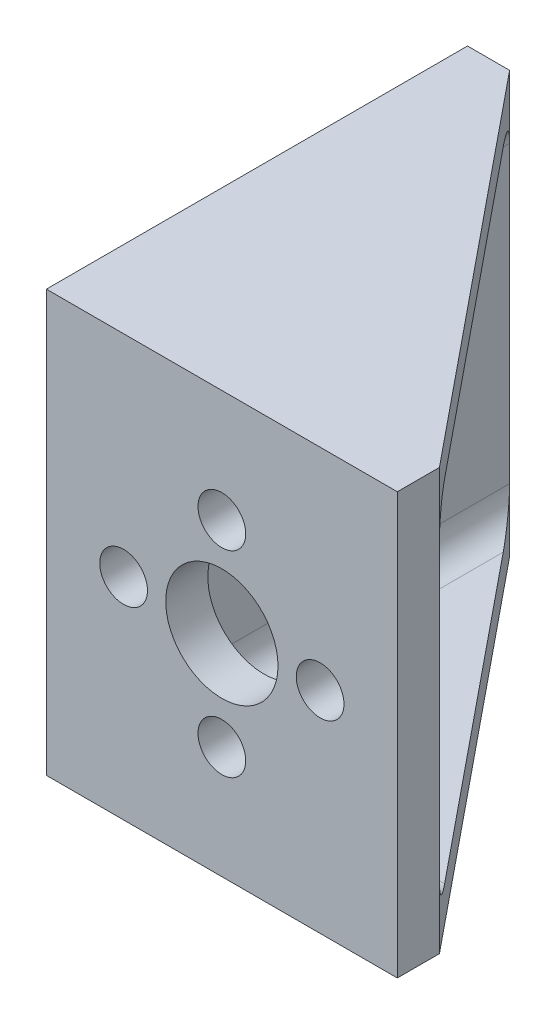
ISO-10303-21;
HEADER;
FILE_DESCRIPTION(('STEP AP214'),'2;1');
FILE_NAME('part.step','',(''),(''),'','','');
FILE_SCHEMA(('AUTOMOTIVE_DESIGN { 1 0 10303 214 1 1 1 1 }'));
ENDSEC;
DATA;
#1=APPLICATION_CONTEXT('core data for automotive mechanical design processes');
#2=APPLICATION_PROTOCOL_DEFINITION('international standard','automotive_design',2000,#1);
#3=PRODUCT_CONTEXT('',#1,'mechanical');
#4=PRODUCT('Part','Part','',(#3));
#5=PRODUCT_RELATED_PRODUCT_CATEGORY('part','',(#4));
#6=PRODUCT_DEFINITION_FORMATION('','',#4);
#7=PRODUCT_DEFINITION_CONTEXT('part definition',#1,'design');
#8=PRODUCT_DEFINITION('design','',#6,#7);
#9=PRODUCT_DEFINITION_SHAPE('','',#8);
#10=(LENGTH_UNIT() NAMED_UNIT(*) SI_UNIT(.MILLI.,.METRE.));
#11=(NAMED_UNIT(*) PLANE_ANGLE_UNIT() SI_UNIT($,.RADIAN.));
#12=(NAMED_UNIT(*) SI_UNIT($,.STERADIAN.) SOLID_ANGLE_UNIT());
#13=UNCERTAINTY_MEASURE_WITH_UNIT(LENGTH_MEASURE(1.E-05),#10,'distance_accuracy_value','');
#14=(GEOMETRIC_REPRESENTATION_CONTEXT(3) GLOBAL_UNCERTAINTY_ASSIGNED_CONTEXT((#13)) GLOBAL_UNIT_ASSIGNED_CONTEXT((#10,
#11,#12)) REPRESENTATION_CONTEXT('',''));
#15=CARTESIAN_POINT('',(0.,0.,0.));
#16=DIRECTION('',(0.,0.,1.));
#17=DIRECTION('',(1.,0.,0.));
#18=AXIS2_PLACEMENT_3D('',#15,#16,#17);
#19=CARTESIAN_POINT('',(3.,30.,-3.));
#20=DIRECTION('',(0.,0.,1.));
#21=DIRECTION('',(1.,0.,0.));
#22=AXIS2_PLACEMENT_3D('',#19,#20,#21);
#23=PLANE('',#22);
#24=CARTESIAN_POINT('',(12.5,22.,-3.));
#25=DIRECTION('',(0.,0.,1.));
#26=DIRECTION('',(1.,0.,0.));
#27=AXIS2_PLACEMENT_3D('',#24,#25,#26);
#28=CIRCLE('',#27,1.7);
#29=CARTESIAN_POINT('',(14.2,22.,-3.));
#30=VERTEX_POINT('',#29);
#31=EDGE_CURVE('E200',#30,#30,#28,.T.);
#32=ORIENTED_EDGE('',*,*,#31,.T.);
#33=EDGE_LOOP('',(#32));
#34=FACE_BOUND('',#33,.T.);
#35=CARTESIAN_POINT('',(19.5,15.,-3.));
#36=DIRECTION('',(0.,0.,1.));
#37=DIRECTION('',(1.,0.,0.));
#38=AXIS2_PLACEMENT_3D('',#35,#36,#37);
#39=CIRCLE('',#38,1.7);
#40=CARTESIAN_POINT('',(21.2,15.,-3.));
#41=VERTEX_POINT('',#40);
#42=EDGE_CURVE('E197',#41,#41,#39,.T.);
#43=ORIENTED_EDGE('',*,*,#42,.T.);
#44=EDGE_LOOP('',(#43));
#45=FACE_BOUND('',#44,.T.);
#46=CARTESIAN_POINT('',(12.5,8.,-3.));
#47=DIRECTION('',(0.,0.,1.));
#48=DIRECTION('',(1.,0.,0.));
#49=AXIS2_PLACEMENT_3D('',#46,#47,#48);
#50=CIRCLE('',#49,1.7);
#51=CARTESIAN_POINT('',(14.2,8.,-3.));
#52=VERTEX_POINT('',#51);
#53=EDGE_CURVE('E194',#52,#52,#50,.T.);
#54=ORIENTED_EDGE('',*,*,#53,.T.);
#55=EDGE_LOOP('',(#54));
#56=FACE_BOUND('',#55,.T.);
#57=CARTESIAN_POINT('',(5.5,15.,-3.));
#58=DIRECTION('',(0.,0.,1.));
#59=DIRECTION('',(1.,0.,0.));
#60=AXIS2_PLACEMENT_3D('',#57,#58,#59);
#61=CIRCLE('',#60,1.7);
#62=CARTESIAN_POINT('',(7.2,15.,-3.));
#63=VERTEX_POINT('',#62);
#64=EDGE_CURVE('E191',#63,#63,#61,.T.);
#65=ORIENTED_EDGE('',*,*,#64,.T.);
#66=EDGE_LOOP('',(#65));
#67=FACE_BOUND('',#66,.T.);
#68=CARTESIAN_POINT('',(12.5,15.,-3.));
#69=DIRECTION('',(0.,0.,1.));
#70=DIRECTION('',(1.,0.,0.));
#71=AXIS2_PLACEMENT_3D('',#68,#69,#70);
#72=CIRCLE('',#71,4.);
#73=CARTESIAN_POINT('',(16.5,15.,-3.));
#74=VERTEX_POINT('',#73);
#75=EDGE_CURVE('E188',#74,#74,#72,.T.);
#76=ORIENTED_EDGE('',*,*,#75,.T.);
#77=EDGE_LOOP('',(#76));
#78=FACE_BOUND('',#77,.T.);
#79=DIRECTION('',(1.,0.,0.));
#80=VECTOR('',#79,1.);
#81=CARTESIAN_POINT('',(3.,4.5,-3.));
#82=LINE('',#81,#80);
#83=CARTESIAN_POINT('',(25.,4.5,-3.));
#84=VERTEX_POINT('',#83);
#85=CARTESIAN_POINT('',(3.6,4.5,-3.));
#86=VERTEX_POINT('',#85);
#87=EDGE_CURVE('E505',#84,#86,#82,.F.);
#88=ORIENTED_EDGE('',*,*,#87,.T.);
#89=DIRECTION('',(0.,1.,0.));
#90=VECTOR('',#89,1.);
#91=CARTESIAN_POINT('',(3.6,25.5,-3.));
#92=LINE('',#91,#90);
#93=CARTESIAN_POINT('',(3.6,25.5,-3.));
#94=VERTEX_POINT('',#93);
#95=EDGE_CURVE('E52',#86,#94,#92,.T.);
#96=ORIENTED_EDGE('',*,*,#95,.T.);
#97=DIRECTION('',(-1.,0.,0.));
#98=VECTOR('',#97,1.);
#99=CARTESIAN_POINT('',(25.,25.5,-3.));
#100=LINE('',#99,#98);
#101=CARTESIAN_POINT('',(25.,25.5,-3.));
#102=VERTEX_POINT('',#101);
#103=EDGE_CURVE('E321',#94,#102,#100,.F.);
#104=ORIENTED_EDGE('',*,*,#103,.T.);
#105=DIRECTION('',(0.,-1.,0.));
#106=VECTOR('',#105,1.);
#107=CARTESIAN_POINT('',(25.,30.,-3.));
#108=LINE('',#107,#106);
#109=EDGE_CURVE('E248',#102,#84,#108,.T.);
#110=ORIENTED_EDGE('',*,*,#109,.T.);
#111=EDGE_LOOP('',(#88,#96,#104,#110));
#112=FACE_BOUND('',#111,.T.);
#113=ADVANCED_FACE('F42',(#34,#45,#56,#67,#78,#112),#23,.F.);
#114=CARTESIAN_POINT('',(3.,30.,-30.));
#115=DIRECTION('',(-1.,0.,0.));
#116=DIRECTION('',(0.,0.,1.));
#117=AXIS2_PLACEMENT_3D('',#114,#115,#116);
#118=PLANE('',#117);
#119=CARTESIAN_POINT('',(3.,15.,-20.));
#120=DIRECTION('',(-1.,0.,0.));
#121=DIRECTION('',(0.,0.,1.));
#122=AXIS2_PLACEMENT_3D('',#119,#120,#121);
#123=CIRCLE('',#122,2.75);
#124=CARTESIAN_POINT('',(3.,15.,-17.25));
#125=VERTEX_POINT('',#124);
#126=EDGE_CURVE('E428',#125,#125,#123,.T.);
#127=ORIENTED_EDGE('',*,*,#126,.T.);
#128=EDGE_LOOP('',(#127));
#129=FACE_BOUND('',#128,.T.);
#130=DIRECTION('',(0.,0.,-1.));
#131=VECTOR('',#130,1.);
#132=CARTESIAN_POINT('',(3.,25.5,-3.));
#133=LINE('',#132,#131);
#134=CARTESIAN_POINT('',(3.,25.5,-30.));
#135=VERTEX_POINT('',#134);
#136=CARTESIAN_POINT('',(3.,25.5,-3.6));
#137=VERTEX_POINT('',#136);
#138=EDGE_CURVE('E264',#135,#137,#133,.F.);
#139=ORIENTED_EDGE('',*,*,#138,.T.);
#140=DIRECTION('',(0.,-1.,0.));
#141=VECTOR('',#140,1.);
#142=CARTESIAN_POINT('',(3.,4.5,-3.6));
#143=LINE('',#142,#141);
#144=CARTESIAN_POINT('',(3.,4.5,-3.6));
#145=VERTEX_POINT('',#144);
#146=EDGE_CURVE('E69',#137,#145,#143,.T.);
#147=ORIENTED_EDGE('',*,*,#146,.T.);
#148=DIRECTION('',(0.,0.,1.));
#149=VECTOR('',#148,1.);
#150=CARTESIAN_POINT('',(3.,4.5,-30.));
#151=LINE('',#150,#149);
#152=CARTESIAN_POINT('',(3.00000000000001,4.5,-30.));
#153=VERTEX_POINT('',#152);
#154=EDGE_CURVE('E267',#145,#153,#151,.F.);
#155=ORIENTED_EDGE('',*,*,#154,.T.);
#156=DIRECTION('',(0.,-1.,0.));
#157=VECTOR('',#156,1.);
#158=CARTESIAN_POINT('',(3.,30.,-30.));
#159=LINE('',#158,#157);
#160=EDGE_CURVE('E245',#135,#153,#159,.T.);
#161=ORIENTED_EDGE('',*,*,#160,.F.);
#162=EDGE_LOOP('',(#139,#147,#155,#161));
#163=FACE_BOUND('',#162,.T.);
#164=ADVANCED_FACE('F343',(#129,#163),#118,.F.);
#165=CARTESIAN_POINT('',(25.,30.,0.));
#166=DIRECTION('',(0.,0.,-1.));
#167=DIRECTION('',(-1.,0.,0.));
#168=AXIS2_PLACEMENT_3D('',#165,#166,#167);
#169=PLANE('',#168);
#170=CARTESIAN_POINT('',(12.5,22.,0.));
#171=DIRECTION('',(0.,0.,1.));
#172=DIRECTION('',(1.,0.,0.));
#173=AXIS2_PLACEMENT_3D('',#170,#171,#172);
#174=CIRCLE('',#173,1.7);
#175=CARTESIAN_POINT('',(14.2,22.,0.));
#176=VERTEX_POINT('',#175);
#177=EDGE_CURVE('E180',#176,#176,#174,.T.);
#178=ORIENTED_EDGE('',*,*,#177,.F.);
#179=EDGE_LOOP('',(#178));
#180=FACE_BOUND('',#179,.T.);
#181=CARTESIAN_POINT('',(19.5,15.,0.));
#182=DIRECTION('',(0.,0.,1.));
#183=DIRECTION('',(1.,0.,0.));
#184=AXIS2_PLACEMENT_3D('',#181,#182,#183);
#185=CIRCLE('',#184,1.7);
#186=CARTESIAN_POINT('',(21.2,15.,0.));
#187=VERTEX_POINT('',#186);
#188=EDGE_CURVE('E177',#187,#187,#185,.T.);
#189=ORIENTED_EDGE('',*,*,#188,.F.);
#190=EDGE_LOOP('',(#189));
#191=FACE_BOUND('',#190,.T.);
#192=CARTESIAN_POINT('',(12.5,8.,0.));
#193=DIRECTION('',(0.,0.,1.));
#194=DIRECTION('',(1.,0.,0.));
#195=AXIS2_PLACEMENT_3D('',#192,#193,#194);
#196=CIRCLE('',#195,1.7);
#197=CARTESIAN_POINT('',(14.2,8.,0.));
#198=VERTEX_POINT('',#197);
#199=EDGE_CURVE('E174',#198,#198,#196,.T.);
#200=ORIENTED_EDGE('',*,*,#199,.F.);
#201=EDGE_LOOP('',(#200));
#202=FACE_BOUND('',#201,.T.);
#203=CARTESIAN_POINT('',(5.5,15.,0.));
#204=DIRECTION('',(0.,0.,1.));
#205=DIRECTION('',(1.,0.,0.));
#206=AXIS2_PLACEMENT_3D('',#203,#204,#205);
#207=CIRCLE('',#206,1.7);
#208=CARTESIAN_POINT('',(7.2,15.,0.));
#209=VERTEX_POINT('',#208);
#210=EDGE_CURVE('E170',#209,#209,#207,.T.);
#211=ORIENTED_EDGE('',*,*,#210,.F.);
#212=EDGE_LOOP('',(#211));
#213=FACE_BOUND('',#212,.T.);
#214=CARTESIAN_POINT('',(12.5,15.,0.));
#215=DIRECTION('',(0.,0.,1.));
#216=DIRECTION('',(1.,0.,0.));
#217=AXIS2_PLACEMENT_3D('',#214,#215,#216);
#218=CIRCLE('',#217,4.);
#219=CARTESIAN_POINT('',(16.5,15.,0.));
#220=VERTEX_POINT('',#219);
#221=EDGE_CURVE('E183',#220,#220,#218,.T.);
#222=ORIENTED_EDGE('',*,*,#221,.F.);
#223=EDGE_LOOP('',(#222));
#224=FACE_BOUND('',#223,.T.);
#225=DIRECTION('',(1.,0.,0.));
#226=VECTOR('',#225,1.);
#227=CARTESIAN_POINT('',(25.,0.,0.));
#228=LINE('',#227,#226);
#229=CARTESIAN_POINT('',(0.,0.,0.));
#230=VERTEX_POINT('',#229);
#231=CARTESIAN_POINT('',(25.,0.,0.));
#232=VERTEX_POINT('',#231);
#233=EDGE_CURVE('E218',#230,#232,#228,.T.);
#234=ORIENTED_EDGE('',*,*,#233,.T.);
#235=DIRECTION('',(0.,-1.,0.));
#236=VECTOR('',#235,1.);
#237=CARTESIAN_POINT('',(25.,30.,0.));
#238=LINE('',#237,#236);
#239=CARTESIAN_POINT('',(25.,30.,0.));
#240=VERTEX_POINT('',#239);
#241=EDGE_CURVE('E252',#240,#232,#238,.T.);
#242=ORIENTED_EDGE('',*,*,#241,.F.);
#243=DIRECTION('',(1.,0.,0.));
#244=VECTOR('',#243,1.);
#245=CARTESIAN_POINT('',(25.,30.,0.));
#246=LINE('',#245,#244);
#247=CARTESIAN_POINT('',(0.,30.,0.));
#248=VERTEX_POINT('',#247);
#249=EDGE_CURVE('E221',#248,#240,#246,.T.);
#250=ORIENTED_EDGE('',*,*,#249,.F.);
#251=DIRECTION('',(0.,-1.,0.));
#252=VECTOR('',#251,1.);
#253=CARTESIAN_POINT('',(0.,30.,0.));
#254=LINE('',#253,#252);
#255=EDGE_CURVE('E232',#248,#230,#254,.T.);
#256=ORIENTED_EDGE('',*,*,#255,.T.);
#257=EDGE_LOOP('',(#234,#242,#250,#256));
#258=FACE_BOUND('',#257,.T.);
#259=ADVANCED_FACE('F339',(#180,#191,#202,#213,#224,#258),#169,.F.);
#260=CARTESIAN_POINT('',(25.,30.,-3.));
#261=DIRECTION('',(-1.,0.,0.));
#262=DIRECTION('',(0.,0.,1.));
#263=AXIS2_PLACEMENT_3D('',#260,#261,#262);
#264=PLANE('',#263);
#265=DIRECTION('',(0.,1.,0.));
#266=VECTOR('',#265,1.);
#267=CARTESIAN_POINT('',(25.,30.,-3.));
#268=LINE('',#267,#266);
#269=CARTESIAN_POINT('',(25.,0.,-3.));
#270=VERTEX_POINT('',#269);
#271=EDGE_CURVE('E212',#84,#270,#268,.F.);
#272=ORIENTED_EDGE('',*,*,#271,.F.);
#273=ORIENTED_EDGE('',*,*,#109,.F.);
#274=CARTESIAN_POINT('',(25.,30.,-3.00000000000002));
#275=VERTEX_POINT('',#274);
#276=EDGE_CURVE('E249',#275,#102,#108,.T.);
#277=ORIENTED_EDGE('',*,*,#276,.F.);
#278=DIRECTION('',(0.,0.,-1.));
#279=VECTOR('',#278,1.);
#280=CARTESIAN_POINT('',(25.,30.,-3.));
#281=LINE('',#280,#279);
#282=EDGE_CURVE('E224',#240,#275,#281,.T.);
#283=ORIENTED_EDGE('',*,*,#282,.F.);
#284=ORIENTED_EDGE('',*,*,#241,.T.);
#285=DIRECTION('',(0.,0.,-1.));
#286=VECTOR('',#285,1.);
#287=CARTESIAN_POINT('',(25.,0.,-3.));
#288=LINE('',#287,#286);
#289=EDGE_CURVE('E235',#232,#270,#288,.T.);
#290=ORIENTED_EDGE('',*,*,#289,.T.);
#291=EDGE_LOOP('',(#272,#273,#277,#283,#284,#290));
#292=FACE_BOUND('',#291,.T.);
#293=ADVANCED_FACE('F342',(#292),#264,.F.);
#294=CARTESIAN_POINT('',(0.,30.,-30.));
#295=DIRECTION('',(0.,0.,1.));
#296=DIRECTION('',(1.,0.,0.));
#297=AXIS2_PLACEMENT_3D('',#294,#295,#296);
#298=PLANE('',#297);
#299=DIRECTION('',(0.,-1.,0.));
#300=VECTOR('',#299,1.);
#301=CARTESIAN_POINT('',(0.5,0.,-30.));
#302=LINE('',#301,#300);
#303=CARTESIAN_POINT('',(0.5,22.6655071586947,-30.));
#304=VERTEX_POINT('',#303);
#305=CARTESIAN_POINT('',(0.5,7.33449284130528,-30.));
#306=VERTEX_POINT('',#305);
#307=EDGE_CURVE('E150',#304,#306,#302,.T.);
#308=ORIENTED_EDGE('',*,*,#307,.F.);
#309=DIRECTION('',(-1.,0.,0.));
#310=VECTOR('',#309,1.);
#311=CARTESIAN_POINT('',(0.5,22.6655071586947,-30.));
#312=LINE('',#311,#310);
#313=CARTESIAN_POINT('',(0.,22.6655071586947,-30.));
#314=VERTEX_POINT('',#313);
#315=EDGE_CURVE('E163',#304,#314,#312,.T.);
#316=ORIENTED_EDGE('',*,*,#315,.T.);
#317=DIRECTION('',(0.,-1.,0.));
#318=VECTOR('',#317,1.);
#319=CARTESIAN_POINT('',(0.,30.,-30.));
#320=LINE('',#319,#318);
#321=CARTESIAN_POINT('',(0.,30.,-30.));
#322=VERTEX_POINT('',#321);
#323=EDGE_CURVE('E242',#322,#314,#320,.T.);
#324=ORIENTED_EDGE('',*,*,#323,.F.);
#325=DIRECTION('',(-1.,0.,0.));
#326=VECTOR('',#325,1.);
#327=CARTESIAN_POINT('',(0.,30.,-30.));
#328=LINE('',#327,#326);
#329=CARTESIAN_POINT('',(3.,30.,-30.));
#330=VERTEX_POINT('',#329);
#331=EDGE_CURVE('E228',#330,#322,#328,.T.);
#332=ORIENTED_EDGE('',*,*,#331,.F.);
#333=EDGE_CURVE('E246',#330,#135,#159,.T.);
#334=ORIENTED_EDGE('',*,*,#333,.T.);
#335=ORIENTED_EDGE('',*,*,#160,.T.);
#336=DIRECTION('',(0.,-1.,0.));
#337=VECTOR('',#336,1.);
#338=CARTESIAN_POINT('',(3.00000000000001,30.,-30.));
#339=LINE('',#338,#337);
#340=CARTESIAN_POINT('',(3.,0.,-30.));
#341=VERTEX_POINT('',#340);
#342=EDGE_CURVE('E207',#341,#153,#339,.F.);
#343=ORIENTED_EDGE('',*,*,#342,.F.);
#344=DIRECTION('',(-1.,0.,0.));
#345=VECTOR('',#344,1.);
#346=CARTESIAN_POINT('',(0.,0.,-30.));
#347=LINE('',#346,#345);
#348=CARTESIAN_POINT('',(0.,0.,-30.));
#349=VERTEX_POINT('',#348);
#350=EDGE_CURVE('E237',#341,#349,#347,.T.);
#351=ORIENTED_EDGE('',*,*,#350,.T.);
#352=CARTESIAN_POINT('',(0.,7.33449284130528,-30.));
#353=VERTEX_POINT('',#352);
#354=EDGE_CURVE('E168',#353,#349,#320,.T.);
#355=ORIENTED_EDGE('',*,*,#354,.F.);
#356=DIRECTION('',(-1.,0.,0.));
#357=VECTOR('',#356,1.);
#358=CARTESIAN_POINT('',(0.5,7.33449284130528,-30.));
#359=LINE('',#358,#357);
#360=EDGE_CURVE('E161',#306,#353,#359,.T.);
#361=ORIENTED_EDGE('',*,*,#360,.F.);
#362=EDGE_LOOP('',(#308,#316,#324,#332,#334,#335,#343,#351,#355,#361));
#363=FACE_BOUND('',#362,.T.);
#364=ADVANCED_FACE('F166',(#363),#298,.F.);
#365=CARTESIAN_POINT('',(0.,30.,0.));
#366=DIRECTION('',(1.,0.,0.));
#367=DIRECTION('',(0.,0.,-1.));
#368=AXIS2_PLACEMENT_3D('',#365,#366,#367);
#369=PLANE('',#368);
#370=ORIENTED_EDGE('',*,*,#323,.T.);
#371=CARTESIAN_POINT('',(0.,15.,-20.));
#372=DIRECTION('',(-1.,0.,0.));
#373=DIRECTION('',(0.,0.,1.));
#374=AXIS2_PLACEMENT_3D('',#371,#372,#373);
#375=CIRCLE('',#374,12.6);
#376=EDGE_CURVE('E157',#353,#314,#375,.T.);
#377=ORIENTED_EDGE('',*,*,#376,.F.);
#378=ORIENTED_EDGE('',*,*,#354,.T.);
#379=DIRECTION('',(0.,0.,1.));
#380=VECTOR('',#379,1.);
#381=CARTESIAN_POINT('',(0.,0.,0.));
#382=LINE('',#381,#380);
#383=EDGE_CURVE('E225',#349,#230,#382,.T.);
#384=ORIENTED_EDGE('',*,*,#383,.T.);
#385=ORIENTED_EDGE('',*,*,#255,.F.);
#386=DIRECTION('',(0.,0.,1.));
#387=VECTOR('',#386,1.);
#388=CARTESIAN_POINT('',(0.,30.,0.));
#389=LINE('',#388,#387);
#390=EDGE_CURVE('E230',#322,#248,#389,.T.);
#391=ORIENTED_EDGE('',*,*,#390,.F.);
#392=EDGE_LOOP('',(#370,#377,#378,#384,#385,#391));
#393=FACE_BOUND('',#392,.T.);
#394=ADVANCED_FACE('F356',(#393),#369,.F.);
#395=CARTESIAN_POINT('',(0.,30.,0.));
#396=DIRECTION('',(0.,-1.,0.));
#397=DIRECTION('',(0.,0.,-1.));
#398=AXIS2_PLACEMENT_3D('',#395,#396,#397);
#399=PLANE('',#398);
#400=ORIENTED_EDGE('',*,*,#249,.T.);
#401=ORIENTED_EDGE('',*,*,#282,.T.);
#402=DIRECTION('',(0.631672951162236,0.,0.775234985517289));
#403=VECTOR('',#402,1.);
#404=CARTESIAN_POINT('',(3.,30.,-30.));
#405=LINE('',#404,#403);
#406=EDGE_CURVE('E216',#330,#275,#405,.T.);
#407=ORIENTED_EDGE('',*,*,#406,.F.);
#408=ORIENTED_EDGE('',*,*,#331,.T.);
#409=ORIENTED_EDGE('',*,*,#390,.T.);
#410=EDGE_LOOP('',(#400,#401,#407,#408,#409));
#411=FACE_BOUND('',#410,.T.);
#412=ADVANCED_FACE('F359',(#411),#399,.F.);
#413=CARTESIAN_POINT('',(0.,0.,0.));
#414=DIRECTION('',(0.,-1.,0.));
#415=DIRECTION('',(0.,0.,-1.));
#416=AXIS2_PLACEMENT_3D('',#413,#414,#415);
#417=PLANE('',#416);
#418=ORIENTED_EDGE('',*,*,#350,.F.);
#419=DIRECTION('',(-0.631672951162236,0.,-0.775234985517289));
#420=VECTOR('',#419,1.);
#421=CARTESIAN_POINT('',(25.,0.,-3.));
#422=LINE('',#421,#420);
#423=EDGE_CURVE('E204',#270,#341,#422,.T.);
#424=ORIENTED_EDGE('',*,*,#423,.F.);
#425=ORIENTED_EDGE('',*,*,#289,.F.);
#426=ORIENTED_EDGE('',*,*,#233,.F.);
#427=ORIENTED_EDGE('',*,*,#383,.F.);
#428=EDGE_LOOP('',(#418,#424,#425,#426,#427));
#429=FACE_BOUND('',#428,.T.);
#430=ADVANCED_FACE('F361',(#429),#417,.T.);
#431=CARTESIAN_POINT('',(12.5,27.5,-15.));
#432=DIRECTION('',(0.,1.,0.));
#433=DIRECTION('',(0.,0.,1.));
#434=AXIS2_PLACEMENT_3D('',#431,#432,#433);
#435=PLANE('',#434);
#436=DIRECTION('',(-1.,0.,0.));
#437=VECTOR('',#436,1.);
#438=CARTESIAN_POINT('',(3.,27.5,-5.));
#439=LINE('',#438,#437);
#440=CARTESIAN_POINT('',(23.3703703703704,27.5,-5.00000000000001));
#441=VERTEX_POINT('',#440);
#442=CARTESIAN_POINT('',(5.,27.5,-5.));
#443=VERTEX_POINT('',#442);
#444=EDGE_CURVE('E282',#441,#443,#439,.T.);
#445=ORIENTED_EDGE('',*,*,#444,.T.);
#446=DIRECTION('',(0.,0.,-1.));
#447=VECTOR('',#446,1.);
#448=CARTESIAN_POINT('',(5.,27.5,-30.));
#449=LINE('',#448,#447);
#450=CARTESIAN_POINT('',(5.,27.5,-27.5454545454545));
#451=VERTEX_POINT('',#450);
#452=EDGE_CURVE('E534',#443,#451,#449,.T.);
#453=ORIENTED_EDGE('',*,*,#452,.T.);
#454=DIRECTION('',(0.631672951162236,0.,0.775234985517289));
#455=VECTOR('',#454,1.);
#456=CARTESIAN_POINT('',(3.,27.5,-30.));
#457=LINE('',#456,#455);
#458=EDGE_CURVE('E215',#451,#441,#457,.T.);
#459=ORIENTED_EDGE('',*,*,#458,.T.);
#460=EDGE_LOOP('',(#445,#453,#459));
#461=FACE_BOUND('',#460,.T.);
#462=ADVANCED_FACE('F364',(#461),#435,.F.);
#463=CARTESIAN_POINT('',(3.,30.,-30.));
#464=DIRECTION('',(-0.775234985517289,0.,0.631672951162236));
#465=DIRECTION('',(0.631672951162236,0.,0.775234985517289));
#466=AXIS2_PLACEMENT_3D('',#463,#464,#465);
#467=PLANE('',#466);
#468=ORIENTED_EDGE('',*,*,#276,.T.);
#469=CARTESIAN_POINT('',(23.3703703703704,25.5,-5.));
#470=DIRECTION('',(-0.775234985517289,0.,0.631672951162236));
#471=DIRECTION('',(0.631672951162236,0.,0.775234985517289));
#472=AXIS2_PLACEMENT_3D('',#469,#470,#471);
#473=ELLIPSE('',#472,2.57986292848415,2.);
#474=EDGE_CURVE('E269',#102,#441,#473,.T.);
#475=ORIENTED_EDGE('',*,*,#474,.T.);
#476=ORIENTED_EDGE('',*,*,#458,.F.);
#477=CARTESIAN_POINT('',(5.,25.5,-27.5454545454545));
#478=DIRECTION('',(-0.775234985517289,0.,0.631672951162236));
#479=DIRECTION('',(0.631672951162236,0.,0.775234985517289));
#480=AXIS2_PLACEMENT_3D('',#477,#478,#479);
#481=ELLIPSE('',#480,3.16619541223055,2.);
#482=EDGE_CURVE('E524',#451,#135,#481,.T.);
#483=ORIENTED_EDGE('',*,*,#482,.T.);
#484=ORIENTED_EDGE('',*,*,#333,.F.);
#485=ORIENTED_EDGE('',*,*,#406,.T.);
#486=EDGE_LOOP('',(#468,#475,#476,#483,#484,#485));
#487=FACE_BOUND('',#486,.T.);
#488=ADVANCED_FACE('F369',(#487),#467,.F.);
#489=CARTESIAN_POINT('',(12.5,2.5,-15.));
#490=DIRECTION('',(0.,-1.,0.));
#491=DIRECTION('',(0.,0.,-1.));
#492=AXIS2_PLACEMENT_3D('',#489,#490,#491);
#493=PLANE('',#492);
#494=DIRECTION('',(-0.631672951162236,0.,-0.775234985517289));
#495=VECTOR('',#494,1.);
#496=CARTESIAN_POINT('',(25.,2.5,-3.));
#497=LINE('',#496,#495);
#498=CARTESIAN_POINT('',(23.3703703703704,2.5,-5.));
#499=VERTEX_POINT('',#498);
#500=CARTESIAN_POINT('',(5.,2.5,-27.5454545454545));
#501=VERTEX_POINT('',#500);
#502=EDGE_CURVE('E203',#499,#501,#497,.T.);
#503=ORIENTED_EDGE('',*,*,#502,.T.);
#504=DIRECTION('',(0.,0.,1.));
#505=VECTOR('',#504,1.);
#506=CARTESIAN_POINT('',(5.,2.5,-3.));
#507=LINE('',#506,#505);
#508=CARTESIAN_POINT('',(5.,2.5,-5.));
#509=VERTEX_POINT('',#508);
#510=EDGE_CURVE('E268',#501,#509,#507,.T.);
#511=ORIENTED_EDGE('',*,*,#510,.T.);
#512=DIRECTION('',(1.,0.,0.));
#513=VECTOR('',#512,1.);
#514=CARTESIAN_POINT('',(25.,2.5,-5.));
#515=LINE('',#514,#513);
#516=EDGE_CURVE('E254',#509,#499,#515,.T.);
#517=ORIENTED_EDGE('',*,*,#516,.T.);
#518=EDGE_LOOP('',(#503,#511,#517));
#519=FACE_BOUND('',#518,.T.);
#520=ADVANCED_FACE('F372',(#519),#493,.F.);
#521=CARTESIAN_POINT('',(25.,0.,-3.));
#522=DIRECTION('',(-0.775234985517289,0.,0.631672951162236));
#523=DIRECTION('',(-0.631672951162236,0.,-0.775234985517289));
#524=AXIS2_PLACEMENT_3D('',#521,#522,#523);
#525=PLANE('',#524);
#526=ORIENTED_EDGE('',*,*,#502,.F.);
#527=CARTESIAN_POINT('',(23.3703703703704,4.5,-5.));
#528=DIRECTION('',(-0.775234985517289,0.,0.631672951162236));
#529=DIRECTION('',(-0.631672951162236,0.,-0.775234985517289));
#530=AXIS2_PLACEMENT_3D('',#527,#528,#529);
#531=ELLIPSE('',#530,2.57986292848415,2.);
#532=EDGE_CURVE('E527',#499,#84,#531,.T.);
#533=ORIENTED_EDGE('',*,*,#532,.T.);
#534=ORIENTED_EDGE('',*,*,#271,.T.);
#535=ORIENTED_EDGE('',*,*,#423,.T.);
#536=ORIENTED_EDGE('',*,*,#342,.T.);
#537=CARTESIAN_POINT('',(5.,4.5,-27.5454545454546));
#538=DIRECTION('',(-0.775234985517289,0.,0.631672951162236));
#539=DIRECTION('',(-0.631672951162236,0.,-0.775234985517289));
#540=AXIS2_PLACEMENT_3D('',#537,#538,#539);
#541=ELLIPSE('',#540,3.16619541223055,2.);
#542=EDGE_CURVE('E530',#153,#501,#541,.T.);
#543=ORIENTED_EDGE('',*,*,#542,.T.);
#544=EDGE_LOOP('',(#526,#533,#534,#535,#536,#543));
#545=FACE_BOUND('',#544,.T.);
#546=ADVANCED_FACE('F377',(#545),#525,.F.);
#547=CARTESIAN_POINT('',(12.5,15.,-30.));
#548=DIRECTION('',(0.,0.,1.));
#549=DIRECTION('',(1.,0.,0.));
#550=AXIS2_PLACEMENT_3D('',#547,#548,#549);
#551=CYLINDRICAL_SURFACE('',#550,4.);
#552=ORIENTED_EDGE('',*,*,#221,.T.);
#553=EDGE_LOOP('',(#552));
#554=FACE_BOUND('',#553,.T.);
#555=ORIENTED_EDGE('',*,*,#75,.F.);
#556=EDGE_LOOP('',(#555));
#557=FACE_BOUND('',#556,.T.);
#558=ADVANCED_FACE('F380',(#554,#557),#551,.F.);
#559=CARTESIAN_POINT('',(5.5,15.,-30.));
#560=DIRECTION('',(0.,0.,1.));
#561=DIRECTION('',(1.,0.,0.));
#562=AXIS2_PLACEMENT_3D('',#559,#560,#561);
#563=CYLINDRICAL_SURFACE('',#562,1.7);
#564=ORIENTED_EDGE('',*,*,#210,.T.);
#565=EDGE_LOOP('',(#564));
#566=FACE_BOUND('',#565,.T.);
#567=ORIENTED_EDGE('',*,*,#64,.F.);
#568=EDGE_LOOP('',(#567));
#569=FACE_BOUND('',#568,.T.);
#570=ADVANCED_FACE('F387',(#566,#569),#563,.F.);
#571=CARTESIAN_POINT('',(12.5,8.,-30.));
#572=DIRECTION('',(0.,0.,1.));
#573=DIRECTION('',(1.,0.,0.));
#574=AXIS2_PLACEMENT_3D('',#571,#572,#573);
#575=CYLINDRICAL_SURFACE('',#574,1.7);
#576=ORIENTED_EDGE('',*,*,#199,.T.);
#577=EDGE_LOOP('',(#576));
#578=FACE_BOUND('',#577,.T.);
#579=ORIENTED_EDGE('',*,*,#53,.F.);
#580=EDGE_LOOP('',(#579));
#581=FACE_BOUND('',#580,.T.);
#582=ADVANCED_FACE('F393',(#578,#581),#575,.F.);
#583=CARTESIAN_POINT('',(19.5,15.,-30.));
#584=DIRECTION('',(0.,0.,1.));
#585=DIRECTION('',(1.,0.,0.));
#586=AXIS2_PLACEMENT_3D('',#583,#584,#585);
#587=CYLINDRICAL_SURFACE('',#586,1.7);
#588=ORIENTED_EDGE('',*,*,#188,.T.);
#589=EDGE_LOOP('',(#588));
#590=FACE_BOUND('',#589,.T.);
#591=ORIENTED_EDGE('',*,*,#42,.F.);
#592=EDGE_LOOP('',(#591));
#593=FACE_BOUND('',#592,.T.);
#594=ADVANCED_FACE('F389',(#590,#593),#587,.F.);
#595=CARTESIAN_POINT('',(12.5,22.,-30.));
#596=DIRECTION('',(0.,0.,1.));
#597=DIRECTION('',(1.,0.,0.));
#598=AXIS2_PLACEMENT_3D('',#595,#596,#597);
#599=CYLINDRICAL_SURFACE('',#598,1.7);
#600=ORIENTED_EDGE('',*,*,#177,.T.);
#601=EDGE_LOOP('',(#600));
#602=FACE_BOUND('',#601,.T.);
#603=ORIENTED_EDGE('',*,*,#31,.F.);
#604=EDGE_LOOP('',(#603));
#605=FACE_BOUND('',#604,.T.);
#606=ADVANCED_FACE('F392',(#602,#605),#599,.F.);
#607=CARTESIAN_POINT('',(0.5,15.,-20.));
#608=DIRECTION('',(-1.,0.,0.));
#609=DIRECTION('',(0.,0.,1.));
#610=AXIS2_PLACEMENT_3D('',#607,#608,#609);
#611=CYLINDRICAL_SURFACE('',#610,12.6);
#612=ORIENTED_EDGE('',*,*,#376,.T.);
#613=ORIENTED_EDGE('',*,*,#315,.F.);
#614=CARTESIAN_POINT('',(0.5,15.,-20.));
#615=DIRECTION('',(-1.,0.,0.));
#616=DIRECTION('',(0.,0.,1.));
#617=AXIS2_PLACEMENT_3D('',#614,#615,#616);
#618=CIRCLE('',#617,12.6);
#619=EDGE_CURVE('E153',#306,#304,#618,.T.);
#620=ORIENTED_EDGE('',*,*,#619,.F.);
#621=ORIENTED_EDGE('',*,*,#360,.T.);
#622=EDGE_LOOP('',(#612,#613,#620,#621));
#623=FACE_BOUND('',#622,.T.);
#624=ADVANCED_FACE('F160',(#623),#611,.F.);
#625=CARTESIAN_POINT('',(0.5,0.,0.));
#626=DIRECTION('',(-1.,0.,0.));
#627=DIRECTION('',(0.,0.,1.));
#628=AXIS2_PLACEMENT_3D('',#625,#626,#627);
#629=PLANE('',#628);
#630=CARTESIAN_POINT('',(0.5,15.,-20.));
#631=DIRECTION('',(-1.,0.,0.));
#632=DIRECTION('',(0.,0.,1.));
#633=AXIS2_PLACEMENT_3D('',#630,#631,#632);
#634=CIRCLE('',#633,2.15);
#635=CARTESIAN_POINT('',(0.5,15.,-17.85));
#636=VERTEX_POINT('',#635);
#637=EDGE_CURVE('E255',#636,#636,#634,.T.);
#638=ORIENTED_EDGE('',*,*,#637,.F.);
#639=EDGE_LOOP('',(#638));
#640=FACE_BOUND('',#639,.T.);
#641=ORIENTED_EDGE('',*,*,#307,.T.);
#642=ORIENTED_EDGE('',*,*,#619,.T.);
#643=EDGE_LOOP('',(#641,#642));
#644=FACE_BOUND('',#643,.T.);
#645=ADVANCED_FACE('F152',(#640,#644),#629,.T.);
#646=CARTESIAN_POINT('',(0.,15.,-20.));
#647=DIRECTION('',(1.,0.,0.));
#648=DIRECTION('',(0.,0.,-1.));
#649=AXIS2_PLACEMENT_3D('',#646,#647,#648);
#650=CYLINDRICAL_SURFACE('',#649,2.15);
#651=CARTESIAN_POINT('',(2.4,15.,-20.));
#652=DIRECTION('',(-1.,0.,0.));
#653=DIRECTION('',(0.,0.,1.));
#654=AXIS2_PLACEMENT_3D('',#651,#652,#653);
#655=CIRCLE('',#654,2.15);
#656=CARTESIAN_POINT('',(2.4,15.,-17.85));
#657=VERTEX_POINT('',#656);
#658=EDGE_CURVE('E12',#657,#657,#655,.F.);
#659=ORIENTED_EDGE('',*,*,#658,.T.);
#660=EDGE_LOOP('',(#659));
#661=FACE_BOUND('',#660,.T.);
#662=ORIENTED_EDGE('',*,*,#637,.T.);
#663=EDGE_LOOP('',(#662));
#664=FACE_BOUND('',#663,.T.);
#665=ADVANCED_FACE('F408',(#661,#664),#650,.F.);
#666=CARTESIAN_POINT('',(12.5,4.5,-5.));
#667=DIRECTION('',(-1.,0.,0.));
#668=DIRECTION('',(0.,0.,1.));
#669=AXIS2_PLACEMENT_3D('',#666,#667,#668);
#670=CYLINDRICAL_SURFACE('',#669,2.);
#671=ORIENTED_EDGE('',*,*,#516,.F.);
#672=CARTESIAN_POINT('',(3.6,4.5,-3.));
#673=CARTESIAN_POINT('',(3.59999382660945,4.36909957447802,-2.99999118087063));
#674=CARTESIAN_POINT('',(3.60902442306023,4.23820456693661,-3.01289203294318));
#675=CARTESIAN_POINT('',(3.64477679181073,3.98143414499887,-3.06396684544389));
#676=CARTESIAN_POINT('',(3.67150325748521,3.85556935956262,-3.10214751069315));
#677=CARTESIAN_POINT('',(3.74163405148319,3.61369691097701,-3.2023343592617));
#678=CARTESIAN_POINT('',(3.78503547670983,3.49769926029749,-3.26433639529975));
#679=CARTESIAN_POINT('',(3.88684960884305,3.28001980762409,-3.40978515549007));
#680=CARTESIAN_POINT('',(3.94525810121472,3.17834701637564,-3.49322585887817));
#681=CARTESIAN_POINT('',(4.07484291146295,2.99322585887817,-3.67834701637563));
#682=CARTESIAN_POINT('',(4.14601386538751,2.90978515544173,-3.78001980769644));
#683=CARTESIAN_POINT('',(4.29838948215761,2.76433639534808,-3.99769926022515));
#684=CARTESIAN_POINT('',(4.37958783779081,2.70233435919844,-4.11369691112973));
#685=CARTESIAN_POINT('',(4.54889855158694,2.60214751075641,-4.35556935940991));
#686=CARTESIAN_POINT('',(4.63700390165171,2.56396684540056,-4.48143414521673));
#687=CARTESIAN_POINT('',(4.81674319670314,2.51289203298652,-4.73820456671876));
#688=CARTESIAN_POINT('',(4.90836970213462,2.49999118087063,-4.86909957447803));
#689=CARTESIAN_POINT('',(5.,2.5,-5.));
#690=B_SPLINE_CURVE_WITH_KNOTS('',3,(#672,#673,#674,#675,#676,#677,#678,#679,#680,#681,#682,
#683,#684,#685,#686,#687,#688,#689),.UNSPECIFIED.,.F.,.F.,(4,2,2,2,2,2,2,2,4),(1.5707963267949,
1.76714586764426,1.96349540849362,2.15984494934298,2.35619449019234,2.55254403104171,
2.74889357189107,2.94524311274043,3.14159265358979),.UNSPECIFIED.);
#691=EDGE_CURVE('E60',#509,#86,#690,.F.);
#692=ORIENTED_EDGE('',*,*,#691,.T.);
#693=ORIENTED_EDGE('',*,*,#87,.F.);
#694=ORIENTED_EDGE('',*,*,#532,.F.);
#695=EDGE_LOOP('',(#671,#692,#693,#694));
#696=FACE_BOUND('',#695,.T.);
#697=ADVANCED_FACE('F296',(#696),#670,.F.);
#698=CARTESIAN_POINT('',(5.,4.5,-15.));
#699=DIRECTION('',(0.,0.,-1.));
#700=DIRECTION('',(-1.,0.,0.));
#701=AXIS2_PLACEMENT_3D('',#698,#699,#700);
#702=CYLINDRICAL_SURFACE('',#701,2.);
#703=ORIENTED_EDGE('',*,*,#154,.F.);
#704=CARTESIAN_POINT('',(5.,2.5,-5.));
#705=CARTESIAN_POINT('',(4.86909957447803,2.49999118087064,-4.90836970213462));
#706=CARTESIAN_POINT('',(4.73820456671877,2.51289203298652,-4.81674319670313));
#707=CARTESIAN_POINT('',(4.48143414521673,2.56396684540056,-4.63700390165171));
#708=CARTESIAN_POINT('',(4.35556935940992,2.60214751075641,-4.54889855158694));
#709=CARTESIAN_POINT('',(4.11369691112973,2.70233435919845,-4.37958783779081));
#710=CARTESIAN_POINT('',(3.99769926022516,2.76433639534809,-4.2983894821576));
#711=CARTESIAN_POINT('',(3.78001980769645,2.90978515544174,-4.14601386538751));
#712=CARTESIAN_POINT('',(3.67834701637564,2.99322585887818,-4.07484291146294));
#713=CARTESIAN_POINT('',(3.49322585887818,3.17834701637564,-3.94525810121472));
#714=CARTESIAN_POINT('',(3.40978515549008,3.2800198076241,-3.88684960884305));
#715=CARTESIAN_POINT('',(3.26433639529975,3.49769926029749,-3.78503547670983));
#716=CARTESIAN_POINT('',(3.20233435926171,3.61369691097702,-3.74163405148319));
#717=CARTESIAN_POINT('',(3.10214751069316,3.85556935956262,-3.67150325748521));
#718=CARTESIAN_POINT('',(3.0639668454439,3.98143414499887,-3.64477679181073));
#719=CARTESIAN_POINT('',(3.01289203294319,4.23820456693662,-3.60902442306023));
#720=CARTESIAN_POINT('',(2.99999118087064,4.36909957447802,-3.59999382660944));
#721=CARTESIAN_POINT('',(3.00000000000001,4.5,-3.6));
#722=B_SPLINE_CURVE_WITH_KNOTS('',3,(#704,#705,#706,#707,#708,#709,#710,#711,#712,#713,#714,
#715,#716,#717,#718,#719,#720,#721),.UNSPECIFIED.,.F.,.F.,(4,2,2,2,2,2,2,2,4),(1.5707963267949,
1.76714586764426,1.96349540849362,2.15984494934298,2.35619449019234,2.55254403104171,
2.74889357189107,2.94524311274043,3.14159265358979),.UNSPECIFIED.);
#723=EDGE_CURVE('E326',#145,#509,#722,.F.);
#724=ORIENTED_EDGE('',*,*,#723,.T.);
#725=ORIENTED_EDGE('',*,*,#510,.F.);
#726=ORIENTED_EDGE('',*,*,#542,.F.);
#727=EDGE_LOOP('',(#703,#724,#725,#726));
#728=FACE_BOUND('',#727,.T.);
#729=ADVANCED_FACE('F302',(#728),#702,.F.);
#730=CARTESIAN_POINT('',(12.5,25.5,-5.));
#731=DIRECTION('',(1.,0.,0.));
#732=DIRECTION('',(0.,0.,-1.));
#733=AXIS2_PLACEMENT_3D('',#730,#731,#732);
#734=CYLINDRICAL_SURFACE('',#733,2.);
#735=ORIENTED_EDGE('',*,*,#103,.F.);
#736=CARTESIAN_POINT('',(5.,27.5,-5.));
#737=CARTESIAN_POINT('',(4.90836970213462,27.5000088191294,-4.86909957447802));
#738=CARTESIAN_POINT('',(4.81674319670314,27.4871079670135,-4.73820456671876));
#739=CARTESIAN_POINT('',(4.63700390165171,27.4360331545994,-4.48143414521673));
#740=CARTESIAN_POINT('',(4.54889855158695,27.3978524892436,-4.35556935940992));
#741=CARTESIAN_POINT('',(4.37958783779081,27.2976656408016,-4.11369691112973));
#742=CARTESIAN_POINT('',(4.29838948215761,27.2356636046519,-3.99769926022515));
#743=CARTESIAN_POINT('',(4.14601386538751,27.0902148445583,-3.78001980769645));
#744=CARTESIAN_POINT('',(4.07484291146295,27.0067741411218,-3.67834701637564));
#745=CARTESIAN_POINT('',(3.94525810121473,26.8216529836244,-3.49322585887818));
#746=CARTESIAN_POINT('',(3.88684960884306,26.7199801923759,-3.40978515549007));
#747=CARTESIAN_POINT('',(3.78503547670983,26.5023007397025,-3.26433639529975));
#748=CARTESIAN_POINT('',(3.74163405148319,26.386303089023,-3.2023343592617));
#749=CARTESIAN_POINT('',(3.67150325748521,26.1444306404374,-3.10214751069315));
#750=CARTESIAN_POINT('',(3.64477679181073,26.0185658550011,-3.06396684544389));
#751=CARTESIAN_POINT('',(3.60902442306023,25.7617954330634,-3.01289203294318));
#752=CARTESIAN_POINT('',(3.59999382660945,25.630900425522,-2.99999118087063));
#753=CARTESIAN_POINT('',(3.6,25.5,-3.));
#754=B_SPLINE_CURVE_WITH_KNOTS('',3,(#736,#737,#738,#739,#740,#741,#742,#743,#744,#745,#746,
#747,#748,#749,#750,#751,#752,#753),.UNSPECIFIED.,.F.,.F.,(4,2,2,2,2,2,2,2,4),(4.71238898038469,
4.90873852123405,5.10508806208341,5.30143760293278,5.49778714378214,5.6941366846315,
5.89048622548086,6.08683576633022,6.28318530717959),.UNSPECIFIED.);
#755=EDGE_CURVE('E501',#94,#443,#754,.F.);
#756=ORIENTED_EDGE('',*,*,#755,.T.);
#757=ORIENTED_EDGE('',*,*,#444,.F.);
#758=ORIENTED_EDGE('',*,*,#474,.F.);
#759=EDGE_LOOP('',(#735,#756,#757,#758));
#760=FACE_BOUND('',#759,.T.);
#761=ADVANCED_FACE('F295',(#760),#734,.F.);
#762=CARTESIAN_POINT('',(5.,25.5,-15.));
#763=DIRECTION('',(0.,0.,1.));
#764=DIRECTION('',(1.,0.,0.));
#765=AXIS2_PLACEMENT_3D('',#762,#763,#764);
#766=CYLINDRICAL_SURFACE('',#765,2.);
#767=ORIENTED_EDGE('',*,*,#452,.F.);
#768=CARTESIAN_POINT('',(3.00000000000001,25.5,-3.6));
#769=CARTESIAN_POINT('',(2.99999118087064,25.630900425522,-3.59999382660944));
#770=CARTESIAN_POINT('',(3.01289203294319,25.7617954330634,-3.60902442306023));
#771=CARTESIAN_POINT('',(3.0639668454439,26.0185658550011,-3.64477679181073));
#772=CARTESIAN_POINT('',(3.10214751069316,26.1444306404374,-3.67150325748521));
#773=CARTESIAN_POINT('',(3.20233435926171,26.386303089023,-3.74163405148319));
#774=CARTESIAN_POINT('',(3.26433639529975,26.5023007397025,-3.78503547670982));
#775=CARTESIAN_POINT('',(3.40978515549008,26.7199801923759,-3.88684960884305));
#776=CARTESIAN_POINT('',(3.49322585887819,26.8216529836244,-3.94525810121473));
#777=CARTESIAN_POINT('',(3.67834701637564,27.0067741411218,-4.07484291146295));
#778=CARTESIAN_POINT('',(3.78001980769645,27.0902148445583,-4.14601386538751));
#779=CARTESIAN_POINT('',(3.99769926022516,27.2356636046519,-4.2983894821576));
#780=CARTESIAN_POINT('',(4.11369691112974,27.2976656408016,-4.37958783779081));
#781=CARTESIAN_POINT('',(4.35556935940992,27.3978524892436,-4.54889855158694));
#782=CARTESIAN_POINT('',(4.48143414521673,27.4360331545994,-4.63700390165171));
#783=CARTESIAN_POINT('',(4.73820456671876,27.4871079670135,-4.81674319670313));
#784=CARTESIAN_POINT('',(4.86909957447802,27.5000088191294,-4.90836970213462));
#785=CARTESIAN_POINT('',(5.,27.5,-5.));
#786=B_SPLINE_CURVE_WITH_KNOTS('',3,(#768,#769,#770,#771,#772,#773,#774,#775,#776,#777,#778,
#779,#780,#781,#782,#783,#784,#785),.UNSPECIFIED.,.F.,.F.,(4,2,2,2,2,2,2,2,4),(4.71238898038469,
4.90873852123405,5.10508806208341,5.30143760293277,5.49778714378214,5.6941366846315,
5.89048622548086,6.08683576633022,6.28318530717958),.UNSPECIFIED.);
#787=EDGE_CURVE('E277',#443,#137,#786,.F.);
#788=ORIENTED_EDGE('',*,*,#787,.T.);
#789=ORIENTED_EDGE('',*,*,#138,.F.);
#790=ORIENTED_EDGE('',*,*,#482,.F.);
#791=EDGE_LOOP('',(#767,#788,#789,#790));
#792=FACE_BOUND('',#791,.T.);
#793=ADVANCED_FACE('F284',(#792),#766,.F.);
#794=CARTESIAN_POINT('',(5.,2.5,-5.));
#795=CARTESIAN_POINT('',(4.90836970213462,2.49999118087063,-4.86909957447803));
#796=CARTESIAN_POINT('',(4.81674319670314,2.51289203298652,-4.73820456671876));
#797=CARTESIAN_POINT('',(4.63700390165171,2.56396684540056,-4.48143414521673));
#798=CARTESIAN_POINT('',(4.54889855158694,2.60214751075641,-4.35556935940991));
#799=CARTESIAN_POINT('',(4.37958783779081,2.70233435919844,-4.11369691112973));
#800=CARTESIAN_POINT('',(4.29838948215761,2.76433639534808,-3.99769926022515));
#801=CARTESIAN_POINT('',(4.14601386538751,2.90978515544173,-3.78001980769644));
#802=CARTESIAN_POINT('',(4.07484291146295,2.99322585887817,-3.67834701637563));
#803=CARTESIAN_POINT('',(3.94525810121472,3.17834701637564,-3.49322585887817));
#804=CARTESIAN_POINT('',(3.88684960884305,3.28001980762409,-3.40978515549007));
#805=CARTESIAN_POINT('',(3.78503547670983,3.49769926029749,-3.26433639529975));
#806=CARTESIAN_POINT('',(3.74163405148319,3.61369691097701,-3.2023343592617));
#807=CARTESIAN_POINT('',(3.67150325748521,3.85556935956262,-3.10214751069315));
#808=CARTESIAN_POINT('',(3.64477679181073,3.98143414499887,-3.06396684544389));
#809=CARTESIAN_POINT('',(3.60902442306023,4.23820456693661,-3.01289203294318));
#810=CARTESIAN_POINT('',(3.59999382660945,4.36909957447802,-2.99999118087063));
#811=CARTESIAN_POINT('',(3.6,4.5,-3.));
#812=CARTESIAN_POINT('',(5.,2.5,-5.));
#813=CARTESIAN_POINT('',(4.86909957447803,2.49999118087064,-4.90836970213462));
#814=CARTESIAN_POINT('',(4.73820456671877,2.51289203298652,-4.81674319670313));
#815=CARTESIAN_POINT('',(4.48143414521673,2.56396684540056,-4.63700390165171));
#816=CARTESIAN_POINT('',(4.35556935940992,2.60214751075641,-4.54889855158694));
#817=CARTESIAN_POINT('',(4.11369691112973,2.70233435919845,-4.37958783779081));
#818=CARTESIAN_POINT('',(3.99769926022516,2.76433639534809,-4.2983894821576));
#819=CARTESIAN_POINT('',(3.78001980769645,2.90978515544174,-4.14601386538751));
#820=CARTESIAN_POINT('',(3.67834701637564,2.99322585887818,-4.07484291146294));
#821=CARTESIAN_POINT('',(3.49322585887818,3.17834701637564,-3.94525810121472));
#822=CARTESIAN_POINT('',(3.40978515549008,3.2800198076241,-3.88684960884305));
#823=CARTESIAN_POINT('',(3.26433639529975,3.49769926029749,-3.78503547670983));
#824=CARTESIAN_POINT('',(3.20233435926171,3.61369691097702,-3.74163405148319));
#825=CARTESIAN_POINT('',(3.10214751069316,3.85556935956262,-3.67150325748521));
#826=CARTESIAN_POINT('',(3.0639668454439,3.98143414499887,-3.64477679181073));
#827=CARTESIAN_POINT('',(3.01289203294319,4.23820456693662,-3.60902442306023));
#828=CARTESIAN_POINT('',(2.99999118087064,4.36909957447802,-3.59999382660944));
#829=CARTESIAN_POINT('',(3.00000000000001,4.5,-3.6));
#830=B_SPLINE_SURFACE_WITH_KNOTS('',1,3,((#794,#795,#796,#797,#798,#799,#800,#801,#802,#803,
#804,#805,#806,#807,#808,#809,#810,#811),(#812,#813,#814,#815,#816,#817,#818,#819,#820,#821,
#822,#823,#824,#825,#826,#827,#828,#829)),.UNSPECIFIED.,.F.,.F.,.F.,(2,2),(4,2,2,2,2,2,2,2,4),
(0.,1.),(1.5707963267949,1.76714586764426,1.96349540849362,2.15984494934298,2.35619449019234,
2.55254403104171,2.74889357189107,2.94524311274043,3.14159265358979),.UNSPECIFIED.);
#831=CARTESIAN_POINT('',(3.00000000000001,4.5,-3.6));
#832=CARTESIAN_POINT('',(3.6,4.5,-3.));
#833=B_SPLINE_CURVE_WITH_KNOTS('',1,(#831,#832),.UNSPECIFIED.,.F.,.F.,(2,2),(0.,1.),.UNSPECIFIED.);
#834=EDGE_CURVE('E258',#86,#145,#833,.F.);
#835=ORIENTED_EDGE('',*,*,#691,.F.);
#836=ORIENTED_EDGE('',*,*,#723,.F.);
#837=ORIENTED_EDGE('',*,*,#834,.F.);
#838=EDGE_LOOP('',(#835,#836,#837));
#839=FACE_BOUND('',#838,.T.);
#840=ADVANCED_FACE('F294',(#839),#830,.T.);
#841=CARTESIAN_POINT('',(3.,30.,-3.6));
#842=DIRECTION('',(0.707106781186551,0.,-0.707106781186544));
#843=DIRECTION('',(0.,1.,0.));
#844=AXIS2_PLACEMENT_3D('',#841,#842,#843);
#845=PLANE('',#844);
#846=ORIENTED_EDGE('',*,*,#834,.T.);
#847=ORIENTED_EDGE('',*,*,#146,.F.);
#848=CARTESIAN_POINT('',(3.6,25.5,-3.));
#849=CARTESIAN_POINT('',(3.00000000000001,25.5,-3.6));
#850=B_SPLINE_CURVE_WITH_KNOTS('',1,(#848,#849),.UNSPECIFIED.,.F.,.F.,(2,2),(0.,1.),.UNSPECIFIED.);
#851=EDGE_CURVE('E443',#94,#137,#850,.T.);
#852=ORIENTED_EDGE('',*,*,#851,.F.);
#853=ORIENTED_EDGE('',*,*,#95,.F.);
#854=EDGE_LOOP('',(#846,#847,#852,#853));
#855=FACE_BOUND('',#854,.T.);
#856=ADVANCED_FACE('F424',(#855),#845,.T.);
#857=CARTESIAN_POINT('',(5.,27.5,-5.));
#858=CARTESIAN_POINT('',(4.86909957447802,27.5000088191294,-4.90836970213462));
#859=CARTESIAN_POINT('',(4.73820456671876,27.4871079670135,-4.81674319670313));
#860=CARTESIAN_POINT('',(4.48143414521673,27.4360331545994,-4.63700390165171));
#861=CARTESIAN_POINT('',(4.35556935940992,27.3978524892436,-4.54889855158694));
#862=CARTESIAN_POINT('',(4.11369691112974,27.2976656408016,-4.37958783779081));
#863=CARTESIAN_POINT('',(3.99769926022516,27.2356636046519,-4.2983894821576));
#864=CARTESIAN_POINT('',(3.78001980769645,27.0902148445583,-4.14601386538751));
#865=CARTESIAN_POINT('',(3.67834701637564,27.0067741411218,-4.07484291146295));
#866=CARTESIAN_POINT('',(3.49322585887819,26.8216529836244,-3.94525810121473));
#867=CARTESIAN_POINT('',(3.40978515549008,26.7199801923759,-3.88684960884305));
#868=CARTESIAN_POINT('',(3.26433639529975,26.5023007397025,-3.78503547670982));
#869=CARTESIAN_POINT('',(3.20233435926171,26.386303089023,-3.74163405148319));
#870=CARTESIAN_POINT('',(3.10214751069316,26.1444306404374,-3.67150325748521));
#871=CARTESIAN_POINT('',(3.0639668454439,26.0185658550011,-3.64477679181073));
#872=CARTESIAN_POINT('',(3.01289203294319,25.7617954330634,-3.60902442306023));
#873=CARTESIAN_POINT('',(2.99999118087064,25.630900425522,-3.59999382660944));
#874=CARTESIAN_POINT('',(3.00000000000001,25.5,-3.6));
#875=CARTESIAN_POINT('',(5.,27.5,-5.));
#876=CARTESIAN_POINT('',(4.90836970213462,27.5000088191294,-4.86909957447802));
#877=CARTESIAN_POINT('',(4.81674319670314,27.4871079670135,-4.73820456671876));
#878=CARTESIAN_POINT('',(4.63700390165171,27.4360331545994,-4.48143414521673));
#879=CARTESIAN_POINT('',(4.54889855158695,27.3978524892436,-4.35556935940992));
#880=CARTESIAN_POINT('',(4.37958783779081,27.2976656408016,-4.11369691112973));
#881=CARTESIAN_POINT('',(4.29838948215761,27.2356636046519,-3.99769926022515));
#882=CARTESIAN_POINT('',(4.14601386538751,27.0902148445583,-3.78001980769645));
#883=CARTESIAN_POINT('',(4.07484291146295,27.0067741411218,-3.67834701637564));
#884=CARTESIAN_POINT('',(3.94525810121473,26.8216529836244,-3.49322585887818));
#885=CARTESIAN_POINT('',(3.88684960884306,26.7199801923759,-3.40978515549007));
#886=CARTESIAN_POINT('',(3.78503547670983,26.5023007397025,-3.26433639529975));
#887=CARTESIAN_POINT('',(3.74163405148319,26.386303089023,-3.2023343592617));
#888=CARTESIAN_POINT('',(3.67150325748521,26.1444306404374,-3.10214751069315));
#889=CARTESIAN_POINT('',(3.64477679181073,26.0185658550011,-3.06396684544389));
#890=CARTESIAN_POINT('',(3.60902442306023,25.7617954330634,-3.01289203294318));
#891=CARTESIAN_POINT('',(3.59999382660945,25.630900425522,-2.99999118087063));
#892=CARTESIAN_POINT('',(3.6,25.5,-3.));
#893=B_SPLINE_SURFACE_WITH_KNOTS('',1,3,((#857,#858,#859,#860,#861,#862,#863,#864,#865,#866,
#867,#868,#869,#870,#871,#872,#873,#874),(#875,#876,#877,#878,#879,#880,#881,#882,#883,#884,
#885,#886,#887,#888,#889,#890,#891,#892)),.UNSPECIFIED.,.F.,.F.,.F.,(2,2),(4,2,2,2,2,2,2,2,4),
(0.,1.),(4.71238898038469,4.90873852123405,5.10508806208341,5.30143760293278,5.49778714378214,
5.6941366846315,5.89048622548086,6.08683576633022,6.28318530717959),.UNSPECIFIED.);
#894=ORIENTED_EDGE('',*,*,#787,.F.);
#895=ORIENTED_EDGE('',*,*,#755,.F.);
#896=ORIENTED_EDGE('',*,*,#851,.T.);
#897=EDGE_LOOP('',(#894,#895,#896));
#898=FACE_BOUND('',#897,.T.);
#899=ADVANCED_FACE('F304',(#898),#893,.T.);
#900=CARTESIAN_POINT('',(2.4,15.,-20.));
#901=DIRECTION('',(1.,0.,0.));
#902=DIRECTION('',(0.,0.,-1.));
#903=AXIS2_PLACEMENT_3D('',#900,#901,#902);
#904=CONICAL_SURFACE('',#903,2.15,0.785398163397453);
#905=ORIENTED_EDGE('',*,*,#126,.F.);
#906=EDGE_LOOP('',(#905));
#907=FACE_BOUND('',#906,.T.);
#908=ORIENTED_EDGE('',*,*,#658,.F.);
#909=EDGE_LOOP('',(#908));
#910=FACE_BOUND('',#909,.T.);
#911=ADVANCED_FACE('F44',(#907,#910),#904,.F.);
#912=CLOSED_SHELL('',(#113,#164,#259,#293,#364,#394,#412,#430,#462,#488,#520,#546,#558,#570,
#582,#594,#606,#624,#645,#665,#697,#729,#761,#793,#840,#856,#899,#911));
#913=MANIFOLD_SOLID_BREP('B2',#912);
#914=ADVANCED_BREP_SHAPE_REPRESENTATION('',(#18,#913),#14);
#915=SHAPE_DEFINITION_REPRESENTATION(#9,#914);
ENDSEC;
END-ISO-10303-21;
